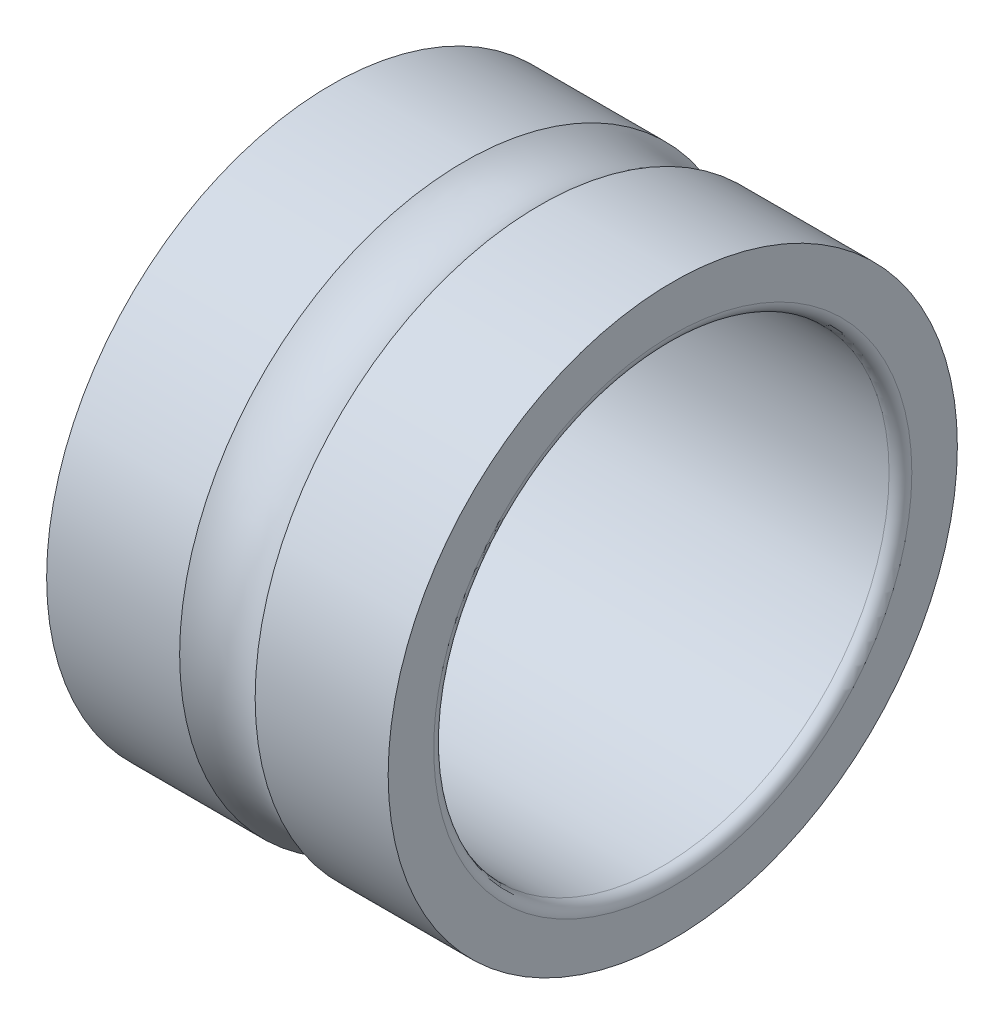
ISO-10303-21;
HEADER;
FILE_DESCRIPTION(('STEP AP214'),'2;1');
FILE_NAME('part.step','',(''),(''),'','','');
FILE_SCHEMA(('AUTOMOTIVE_DESIGN { 1 0 10303 214 1 1 1 1 }'));
ENDSEC;
DATA;
#1=APPLICATION_CONTEXT('core data for automotive mechanical design processes');
#2=APPLICATION_PROTOCOL_DEFINITION('international standard','automotive_design',2000,#1);
#3=PRODUCT_CONTEXT('',#1,'mechanical');
#4=PRODUCT('Part','Part','',(#3));
#5=PRODUCT_RELATED_PRODUCT_CATEGORY('part','',(#4));
#6=PRODUCT_DEFINITION_FORMATION('','',#4);
#7=PRODUCT_DEFINITION_CONTEXT('part definition',#1,'design');
#8=PRODUCT_DEFINITION('design','',#6,#7);
#9=PRODUCT_DEFINITION_SHAPE('','',#8);
#10=(LENGTH_UNIT() NAMED_UNIT(*) SI_UNIT(.MILLI.,.METRE.));
#11=(NAMED_UNIT(*) PLANE_ANGLE_UNIT() SI_UNIT($,.RADIAN.));
#12=(NAMED_UNIT(*) SI_UNIT($,.STERADIAN.) SOLID_ANGLE_UNIT());
#13=UNCERTAINTY_MEASURE_WITH_UNIT(LENGTH_MEASURE(1.E-05),#10,'distance_accuracy_value','');
#14=(GEOMETRIC_REPRESENTATION_CONTEXT(3) GLOBAL_UNCERTAINTY_ASSIGNED_CONTEXT((#13)) GLOBAL_UNIT_ASSIGNED_CONTEXT((#10,
#11,#12)) REPRESENTATION_CONTEXT('',''));
#15=CARTESIAN_POINT('',(0.,0.,0.));
#16=DIRECTION('',(0.,0.,1.));
#17=DIRECTION('',(1.,0.,0.));
#18=AXIS2_PLACEMENT_3D('',#15,#16,#17);
#19=CARTESIAN_POINT('',(0.,2.5,0.));
#20=DIRECTION('',(-1.,0.,0.));
#21=DIRECTION('',(0.,0.,1.));
#22=AXIS2_PLACEMENT_3D('',#19,#20,#21);
#23=PLANE('',#22);
#24=CARTESIAN_POINT('',(0.,0.,0.));
#25=DIRECTION('',(1.,0.,0.));
#26=DIRECTION('',(0.,0.,-1.));
#27=AXIS2_PLACEMENT_3D('',#24,#25,#26);
#28=CIRCLE('',#27,2.09999999999993);
#29=CARTESIAN_POINT('',(0.,0.,-2.09999999999993));
#30=VERTEX_POINT('',#29);
#31=EDGE_CURVE('E5',#30,#30,#28,.T.);
#32=ORIENTED_EDGE('',*,*,#31,.T.);
#33=EDGE_LOOP('',(#32));
#34=FACE_BOUND('',#33,.T.);
#35=CARTESIAN_POINT('',(0.,0.,0.));
#36=DIRECTION('',(1.,0.,0.));
#37=DIRECTION('',(0.,0.,-1.));
#38=AXIS2_PLACEMENT_3D('',#35,#36,#37);
#39=CIRCLE('',#38,2.5);
#40=CARTESIAN_POINT('',(0.,0.,-2.5));
#41=VERTEX_POINT('',#40);
#42=EDGE_CURVE('E9',#41,#41,#39,.T.);
#43=ORIENTED_EDGE('',*,*,#42,.F.);
#44=EDGE_LOOP('',(#43));
#45=FACE_BOUND('',#44,.T.);
#46=ADVANCED_FACE('F13',(#34,#45),#23,.T.);
#47=CARTESIAN_POINT('',(0.0999999999999228,0.,0.));
#48=DIRECTION('',(1.,0.,0.));
#49=DIRECTION('',(0.,0.,-1.));
#50=AXIS2_PLACEMENT_3D('',#47,#48,#49);
#51=TOROIDAL_SURFACE('',#50,2.09999999999993,0.0999999999999228);
#52=CARTESIAN_POINT('',(0.1,0.,0.));
#53=DIRECTION('',(1.,0.,0.));
#54=DIRECTION('',(0.,0.,-1.));
#55=AXIS2_PLACEMENT_3D('',#52,#53,#54);
#56=CIRCLE('',#55,2.);
#57=CARTESIAN_POINT('',(0.1,0.,-2.));
#58=VERTEX_POINT('',#57);
#59=EDGE_CURVE('E24',#58,#58,#56,.T.);
#60=ORIENTED_EDGE('',*,*,#59,.T.);
#61=EDGE_LOOP('',(#60));
#62=FACE_BOUND('',#61,.T.);
#63=ORIENTED_EDGE('',*,*,#31,.F.);
#64=EDGE_LOOP('',(#63));
#65=FACE_BOUND('',#64,.T.);
#66=ADVANCED_FACE('F30',(#62,#65),#51,.T.);
#67=CARTESIAN_POINT('',(3.,0.,0.));
#68=DIRECTION('',(1.,0.,0.));
#69=DIRECTION('',(0.,0.,-1.));
#70=AXIS2_PLACEMENT_3D('',#67,#68,#69);
#71=CYLINDRICAL_SURFACE('',#70,2.5);
#72=ORIENTED_EDGE('',*,*,#42,.T.);
#73=EDGE_LOOP('',(#72));
#74=FACE_BOUND('',#73,.T.);
#75=CARTESIAN_POINT('',(1.1683375209645,0.,0.));
#76=DIRECTION('',(1.,0.,0.));
#77=DIRECTION('',(0.,0.,-1.));
#78=AXIS2_PLACEMENT_3D('',#75,#76,#77);
#79=CIRCLE('',#78,2.5);
#80=CARTESIAN_POINT('',(1.1683375209645,0.,-2.5));
#81=VERTEX_POINT('',#80);
#82=EDGE_CURVE('E39',#81,#81,#79,.T.);
#83=ORIENTED_EDGE('',*,*,#82,.F.);
#84=EDGE_LOOP('',(#83));
#85=FACE_BOUND('',#84,.T.);
#86=ADVANCED_FACE('F43',(#74,#85),#71,.T.);
#87=CARTESIAN_POINT('',(3.,0.,0.));
#88=DIRECTION('',(1.,0.,0.));
#89=DIRECTION('',(0.,0.,-1.));
#90=AXIS2_PLACEMENT_3D('',#87,#88,#89);
#91=CYLINDRICAL_SURFACE('',#90,2.);
#92=CARTESIAN_POINT('',(2.9,0.,0.));
#93=DIRECTION('',(1.,0.,0.));
#94=DIRECTION('',(0.,0.,-1.));
#95=AXIS2_PLACEMENT_3D('',#92,#93,#94);
#96=CIRCLE('',#95,2.);
#97=CARTESIAN_POINT('',(2.9,0.,-2.));
#98=VERTEX_POINT('',#97);
#99=EDGE_CURVE('E50',#98,#98,#96,.T.);
#100=ORIENTED_EDGE('',*,*,#99,.T.);
#101=EDGE_LOOP('',(#100));
#102=FACE_BOUND('',#101,.T.);
#103=ORIENTED_EDGE('',*,*,#59,.F.);
#104=EDGE_LOOP('',(#103));
#105=FACE_BOUND('',#104,.T.);
#106=ADVANCED_FACE('F56',(#102,#105),#91,.F.);
#107=CARTESIAN_POINT('',(1.5,0.,0.));
#108=DIRECTION('',(1.,0.,0.));
#109=DIRECTION('',(0.,0.,-1.));
#110=AXIS2_PLACEMENT_3D('',#107,#108,#109);
#111=TOROIDAL_SURFACE('',#110,2.99999999999986,0.599999999999866);
#112=CARTESIAN_POINT('',(1.8316624790355,0.,0.));
#113=DIRECTION('',(1.,0.,0.));
#114=DIRECTION('',(0.,0.,-1.));
#115=AXIS2_PLACEMENT_3D('',#112,#113,#114);
#116=CIRCLE('',#115,2.5);
#117=CARTESIAN_POINT('',(1.8316624790355,0.,-2.5));
#118=VERTEX_POINT('',#117);
#119=EDGE_CURVE('E63',#118,#118,#116,.T.);
#120=ORIENTED_EDGE('',*,*,#119,.F.);
#121=EDGE_LOOP('',(#120));
#122=FACE_BOUND('',#121,.T.);
#123=ORIENTED_EDGE('',*,*,#82,.T.);
#124=EDGE_LOOP('',(#123));
#125=FACE_BOUND('',#124,.T.);
#126=ADVANCED_FACE('F69',(#122,#125),#111,.F.);
#127=CARTESIAN_POINT('',(2.90000000000015,0.,0.));
#128=DIRECTION('',(1.,0.,0.));
#129=DIRECTION('',(0.,0.,-1.));
#130=AXIS2_PLACEMENT_3D('',#127,#128,#129);
#131=TOROIDAL_SURFACE('',#130,2.09999999999985,0.0999999999998467);
#132=CARTESIAN_POINT('',(3.,0.,0.));
#133=DIRECTION('',(1.,0.,0.));
#134=DIRECTION('',(0.,0.,-1.));
#135=AXIS2_PLACEMENT_3D('',#132,#133,#134);
#136=CIRCLE('',#135,2.10000001788124);
#137=CARTESIAN_POINT('',(3.,0.,-2.10000001788124));
#138=VERTEX_POINT('',#137);
#139=EDGE_CURVE('E76',#138,#138,#136,.T.);
#140=ORIENTED_EDGE('',*,*,#139,.T.);
#141=EDGE_LOOP('',(#140));
#142=FACE_BOUND('',#141,.T.);
#143=ORIENTED_EDGE('',*,*,#99,.F.);
#144=EDGE_LOOP('',(#143));
#145=FACE_BOUND('',#144,.T.);
#146=ADVANCED_FACE('F82',(#142,#145),#131,.T.);
#147=CARTESIAN_POINT('',(3.,0.,0.));
#148=DIRECTION('',(1.,0.,0.));
#149=DIRECTION('',(0.,0.,-1.));
#150=AXIS2_PLACEMENT_3D('',#147,#148,#149);
#151=CYLINDRICAL_SURFACE('',#150,2.5);
#152=ORIENTED_EDGE('',*,*,#119,.T.);
#153=EDGE_LOOP('',(#152));
#154=FACE_BOUND('',#153,.T.);
#155=CARTESIAN_POINT('',(3.,0.,0.));
#156=DIRECTION('',(1.,0.,0.));
#157=DIRECTION('',(0.,0.,-1.));
#158=AXIS2_PLACEMENT_3D('',#155,#156,#157);
#159=CIRCLE('',#158,2.5);
#160=CARTESIAN_POINT('',(3.,0.,-2.5));
#161=VERTEX_POINT('',#160);
#162=EDGE_CURVE('E91',#161,#161,#159,.T.);
#163=ORIENTED_EDGE('',*,*,#162,.F.);
#164=EDGE_LOOP('',(#163));
#165=FACE_BOUND('',#164,.T.);
#166=ADVANCED_FACE('F95',(#154,#165),#151,.T.);
#167=CARTESIAN_POINT('',(3.,2.1,0.));
#168=DIRECTION('',(1.,0.,0.));
#169=DIRECTION('',(0.,0.,-1.));
#170=AXIS2_PLACEMENT_3D('',#167,#168,#169);
#171=PLANE('',#170);
#172=ORIENTED_EDGE('',*,*,#162,.T.);
#173=EDGE_LOOP('',(#172));
#174=FACE_BOUND('',#173,.T.);
#175=ORIENTED_EDGE('',*,*,#139,.F.);
#176=EDGE_LOOP('',(#175));
#177=FACE_BOUND('',#176,.T.);
#178=ADVANCED_FACE('F106',(#174,#177),#171,.T.);
#179=CLOSED_SHELL('',(#46,#66,#86,#106,#126,#146,#166,#178));
#180=MANIFOLD_SOLID_BREP('B1',#179);
#181=ADVANCED_BREP_SHAPE_REPRESENTATION('',(#18,#180),#14);
#182=SHAPE_DEFINITION_REPRESENTATION(#9,#181);
ENDSEC;
END-ISO-10303-21;
